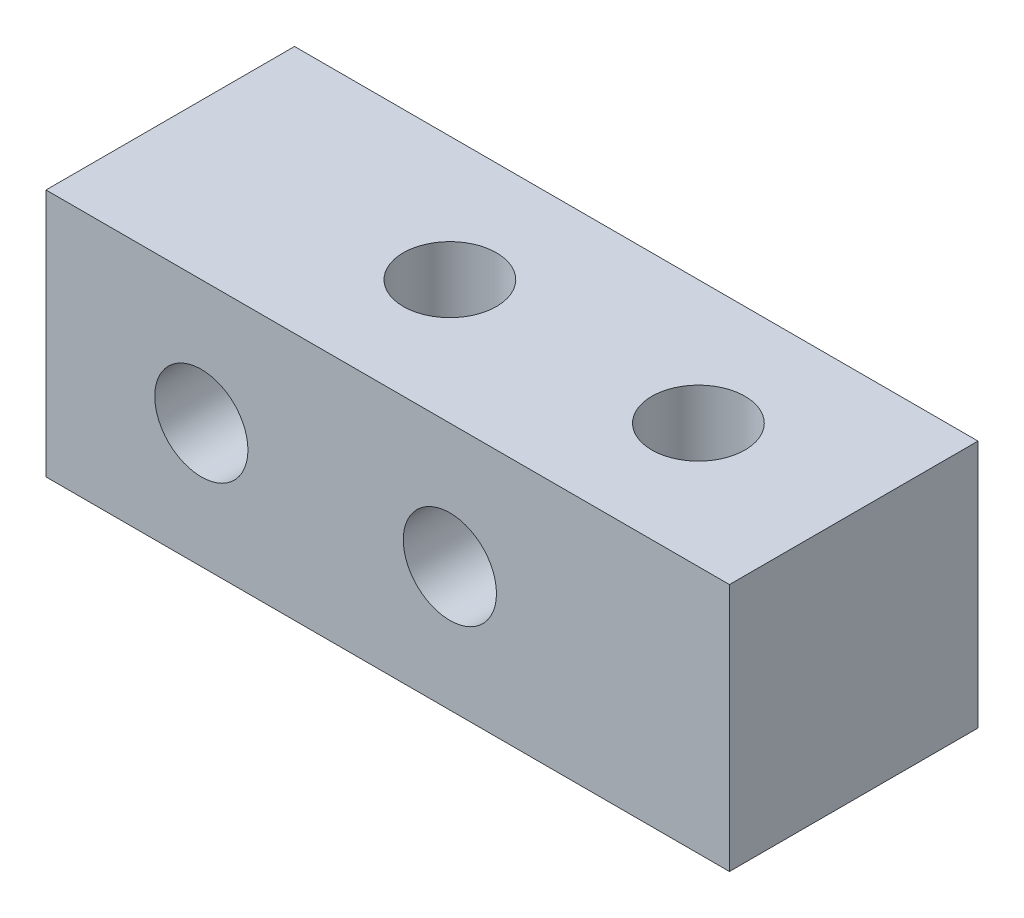
ISO-10303-21;
HEADER;
FILE_DESCRIPTION(('STEP AP214'),'2;1');
FILE_NAME('part.step','',(''),(''),'','','');
FILE_SCHEMA(('AUTOMOTIVE_DESIGN { 1 0 10303 214 1 1 1 1 }'));
ENDSEC;
DATA;
#1=APPLICATION_CONTEXT('core data for automotive mechanical design processes');
#2=APPLICATION_PROTOCOL_DEFINITION('international standard','automotive_design',2000,#1);
#3=PRODUCT_CONTEXT('',#1,'mechanical');
#4=PRODUCT('Part','Part','',(#3));
#5=PRODUCT_RELATED_PRODUCT_CATEGORY('part','',(#4));
#6=PRODUCT_DEFINITION_FORMATION('','',#4);
#7=PRODUCT_DEFINITION_CONTEXT('part definition',#1,'design');
#8=PRODUCT_DEFINITION('design','',#6,#7);
#9=PRODUCT_DEFINITION_SHAPE('','',#8);
#10=(LENGTH_UNIT() NAMED_UNIT(*) SI_UNIT(.MILLI.,.METRE.));
#11=(NAMED_UNIT(*) PLANE_ANGLE_UNIT() SI_UNIT($,.RADIAN.));
#12=(NAMED_UNIT(*) SI_UNIT($,.STERADIAN.) SOLID_ANGLE_UNIT());
#13=UNCERTAINTY_MEASURE_WITH_UNIT(LENGTH_MEASURE(1.E-05),#10,'distance_accuracy_value','');
#14=(GEOMETRIC_REPRESENTATION_CONTEXT(3) GLOBAL_UNCERTAINTY_ASSIGNED_CONTEXT((#13)) GLOBAL_UNIT_ASSIGNED_CONTEXT((#10,
#11,#12)) REPRESENTATION_CONTEXT('',''));
#15=CARTESIAN_POINT('',(0.,0.,0.));
#16=DIRECTION('',(0.,0.,1.));
#17=DIRECTION('',(1.,0.,0.));
#18=AXIS2_PLACEMENT_3D('',#15,#16,#17);
#19=CARTESIAN_POINT('',(0.,8.,0.));
#20=DIRECTION('',(0.,-1.,0.));
#21=DIRECTION('',(0.,0.,-1.));
#22=AXIS2_PLACEMENT_3D('',#19,#20,#21);
#23=PLANE('',#22);
#24=DIRECTION('',(0.,0.,-1.));
#25=VECTOR('',#24,1.);
#26=CARTESIAN_POINT('',(11.,8.,4.));
#27=LINE('',#26,#25);
#28=CARTESIAN_POINT('',(11.,8.,4.));
#29=VERTEX_POINT('',#28);
#30=CARTESIAN_POINT('',(11.,8.,-4.));
#31=VERTEX_POINT('',#30);
#32=EDGE_CURVE('E93',#29,#31,#27,.T.);
#33=ORIENTED_EDGE('',*,*,#32,.T.);
#34=DIRECTION('',(-1.,0.,0.));
#35=VECTOR('',#34,1.);
#36=CARTESIAN_POINT('',(-11.,8.,-4.));
#37=LINE('',#36,#35);
#38=CARTESIAN_POINT('',(-11.,8.,-4.));
#39=VERTEX_POINT('',#38);
#40=EDGE_CURVE('E88',#31,#39,#37,.T.);
#41=ORIENTED_EDGE('',*,*,#40,.T.);
#42=DIRECTION('',(0.,0.,1.));
#43=VECTOR('',#42,1.);
#44=CARTESIAN_POINT('',(-11.,8.,4.));
#45=LINE('',#44,#43);
#46=CARTESIAN_POINT('',(-11.,8.,4.));
#47=VERTEX_POINT('',#46);
#48=EDGE_CURVE('E91',#39,#47,#45,.T.);
#49=ORIENTED_EDGE('',*,*,#48,.T.);
#50=DIRECTION('',(1.,0.,0.));
#51=VECTOR('',#50,1.);
#52=CARTESIAN_POINT('',(-11.,8.,4.));
#53=LINE('',#52,#51);
#54=EDGE_CURVE('E58',#47,#29,#53,.T.);
#55=ORIENTED_EDGE('',*,*,#54,.T.);
#56=EDGE_LOOP('',(#33,#41,#49,#55));
#57=FACE_BOUND('',#56,.T.);
#58=CARTESIAN_POINT('',(6.,8.,0.));
#59=DIRECTION('',(0.,1.,0.));
#60=DIRECTION('',(0.,0.,1.));
#61=AXIS2_PLACEMENT_3D('',#58,#59,#60);
#62=CIRCLE('',#61,1.5);
#63=CARTESIAN_POINT('',(6.,8.,1.5));
#64=VERTEX_POINT('',#63);
#65=EDGE_CURVE('E108',#64,#64,#62,.T.);
#66=ORIENTED_EDGE('',*,*,#65,.F.);
#67=EDGE_LOOP('',(#66));
#68=FACE_BOUND('',#67,.T.);
#69=CARTESIAN_POINT('',(-2.,8.,0.));
#70=DIRECTION('',(0.,1.,0.));
#71=DIRECTION('',(0.,0.,1.));
#72=AXIS2_PLACEMENT_3D('',#69,#70,#71);
#73=CIRCLE('',#72,1.5);
#74=CARTESIAN_POINT('',(-2.,8.,1.5));
#75=VERTEX_POINT('',#74);
#76=EDGE_CURVE('E123',#75,#75,#73,.T.);
#77=ORIENTED_EDGE('',*,*,#76,.F.);
#78=EDGE_LOOP('',(#77));
#79=FACE_BOUND('',#78,.T.);
#80=ADVANCED_FACE('F41',(#57,#68,#79),#23,.F.);
#81=CARTESIAN_POINT('',(0.,0.,0.));
#82=DIRECTION('',(0.,-1.,0.));
#83=DIRECTION('',(0.,0.,-1.));
#84=AXIS2_PLACEMENT_3D('',#81,#82,#83);
#85=PLANE('',#84);
#86=CARTESIAN_POINT('',(6.,0.,0.));
#87=DIRECTION('',(0.,1.,0.));
#88=DIRECTION('',(0.,0.,1.));
#89=AXIS2_PLACEMENT_3D('',#86,#87,#88);
#90=CIRCLE('',#89,1.5);
#91=CARTESIAN_POINT('',(6.,0.,1.5));
#92=VERTEX_POINT('',#91);
#93=EDGE_CURVE('E120',#92,#92,#90,.T.);
#94=ORIENTED_EDGE('',*,*,#93,.T.);
#95=EDGE_LOOP('',(#94));
#96=FACE_BOUND('',#95,.T.);
#97=DIRECTION('',(0.,0.,-1.));
#98=VECTOR('',#97,1.);
#99=CARTESIAN_POINT('',(11.,0.,4.));
#100=LINE('',#99,#98);
#101=CARTESIAN_POINT('',(11.,0.,4.));
#102=VERTEX_POINT('',#101);
#103=CARTESIAN_POINT('',(11.,0.,-4.));
#104=VERTEX_POINT('',#103);
#105=EDGE_CURVE('E105',#102,#104,#100,.T.);
#106=ORIENTED_EDGE('',*,*,#105,.F.);
#107=DIRECTION('',(1.,0.,0.));
#108=VECTOR('',#107,1.);
#109=CARTESIAN_POINT('',(-11.,0.,4.));
#110=LINE('',#109,#108);
#111=CARTESIAN_POINT('',(-11.,0.,4.));
#112=VERTEX_POINT('',#111);
#113=EDGE_CURVE('E81',#112,#102,#110,.T.);
#114=ORIENTED_EDGE('',*,*,#113,.F.);
#115=DIRECTION('',(0.,0.,1.));
#116=VECTOR('',#115,1.);
#117=CARTESIAN_POINT('',(-11.,0.,4.));
#118=LINE('',#117,#116);
#119=CARTESIAN_POINT('',(-11.,0.,-4.));
#120=VERTEX_POINT('',#119);
#121=EDGE_CURVE('E75',#120,#112,#118,.T.);
#122=ORIENTED_EDGE('',*,*,#121,.F.);
#123=DIRECTION('',(-1.,0.,0.));
#124=VECTOR('',#123,1.);
#125=CARTESIAN_POINT('',(-11.,0.,-4.));
#126=LINE('',#125,#124);
#127=EDGE_CURVE('E97',#104,#120,#126,.T.);
#128=ORIENTED_EDGE('',*,*,#127,.F.);
#129=EDGE_LOOP('',(#106,#114,#122,#128));
#130=FACE_BOUND('',#129,.T.);
#131=CARTESIAN_POINT('',(-2.,0.,0.));
#132=DIRECTION('',(0.,1.,0.));
#133=DIRECTION('',(0.,0.,1.));
#134=AXIS2_PLACEMENT_3D('',#131,#132,#133);
#135=CIRCLE('',#134,1.5);
#136=CARTESIAN_POINT('',(-2.,0.,1.5));
#137=VERTEX_POINT('',#136);
#138=EDGE_CURVE('E126',#137,#137,#135,.T.);
#139=ORIENTED_EDGE('',*,*,#138,.T.);
#140=EDGE_LOOP('',(#139));
#141=FACE_BOUND('',#140,.T.);
#142=ADVANCED_FACE('F116',(#96,#130,#141),#85,.T.);
#143=CARTESIAN_POINT('',(11.,8.,4.));
#144=DIRECTION('',(-1.,0.,0.));
#145=DIRECTION('',(0.,0.,1.));
#146=AXIS2_PLACEMENT_3D('',#143,#144,#145);
#147=PLANE('',#146);
#148=ORIENTED_EDGE('',*,*,#105,.T.);
#149=DIRECTION('',(0.,-1.,0.));
#150=VECTOR('',#149,1.);
#151=CARTESIAN_POINT('',(11.,8.,-4.));
#152=LINE('',#151,#150);
#153=EDGE_CURVE('E11',#31,#104,#152,.T.);
#154=ORIENTED_EDGE('',*,*,#153,.F.);
#155=ORIENTED_EDGE('',*,*,#32,.F.);
#156=DIRECTION('',(0.,-1.,0.));
#157=VECTOR('',#156,1.);
#158=CARTESIAN_POINT('',(11.,8.,4.));
#159=LINE('',#158,#157);
#160=EDGE_CURVE('E101',#29,#102,#159,.T.);
#161=ORIENTED_EDGE('',*,*,#160,.T.);
#162=EDGE_LOOP('',(#148,#154,#155,#161));
#163=FACE_BOUND('',#162,.T.);
#164=ADVANCED_FACE('F43',(#163),#147,.F.);
#165=CARTESIAN_POINT('',(-11.,8.,-4.));
#166=DIRECTION('',(0.,0.,1.));
#167=DIRECTION('',(1.,0.,0.));
#168=AXIS2_PLACEMENT_3D('',#165,#166,#167);
#169=PLANE('',#168);
#170=CARTESIAN_POINT('',(-6.,4.,-4.));
#171=DIRECTION('',(0.,0.,1.));
#172=DIRECTION('',(1.,0.,0.));
#173=AXIS2_PLACEMENT_3D('',#170,#171,#172);
#174=CIRCLE('',#173,1.5);
#175=CARTESIAN_POINT('',(-4.5,4.,-4.));
#176=VERTEX_POINT('',#175);
#177=EDGE_CURVE('E129',#176,#176,#174,.T.);
#178=ORIENTED_EDGE('',*,*,#177,.T.);
#179=EDGE_LOOP('',(#178));
#180=FACE_BOUND('',#179,.T.);
#181=CARTESIAN_POINT('',(2.,4.,-4.));
#182=DIRECTION('',(0.,0.,1.));
#183=DIRECTION('',(1.,0.,0.));
#184=AXIS2_PLACEMENT_3D('',#181,#182,#183);
#185=CIRCLE('',#184,1.5);
#186=CARTESIAN_POINT('',(3.5,4.,-4.));
#187=VERTEX_POINT('',#186);
#188=EDGE_CURVE('E132',#187,#187,#185,.T.);
#189=ORIENTED_EDGE('',*,*,#188,.T.);
#190=EDGE_LOOP('',(#189));
#191=FACE_BOUND('',#190,.T.);
#192=ORIENTED_EDGE('',*,*,#127,.T.);
#193=DIRECTION('',(0.,-1.,0.));
#194=VECTOR('',#193,1.);
#195=CARTESIAN_POINT('',(-11.,8.,-4.));
#196=LINE('',#195,#194);
#197=EDGE_CURVE('E50',#39,#120,#196,.T.);
#198=ORIENTED_EDGE('',*,*,#197,.F.);
#199=ORIENTED_EDGE('',*,*,#40,.F.);
#200=ORIENTED_EDGE('',*,*,#153,.T.);
#201=EDGE_LOOP('',(#192,#198,#199,#200));
#202=FACE_BOUND('',#201,.T.);
#203=ADVANCED_FACE('F96',(#180,#191,#202),#169,.F.);
#204=CARTESIAN_POINT('',(-11.,8.,4.));
#205=DIRECTION('',(1.,0.,0.));
#206=DIRECTION('',(0.,0.,-1.));
#207=AXIS2_PLACEMENT_3D('',#204,#205,#206);
#208=PLANE('',#207);
#209=ORIENTED_EDGE('',*,*,#121,.T.);
#210=DIRECTION('',(0.,-1.,0.));
#211=VECTOR('',#210,1.);
#212=CARTESIAN_POINT('',(-11.,8.,4.));
#213=LINE('',#212,#211);
#214=EDGE_CURVE('E98',#47,#112,#213,.T.);
#215=ORIENTED_EDGE('',*,*,#214,.F.);
#216=ORIENTED_EDGE('',*,*,#48,.F.);
#217=ORIENTED_EDGE('',*,*,#197,.T.);
#218=EDGE_LOOP('',(#209,#215,#216,#217));
#219=FACE_BOUND('',#218,.T.);
#220=ADVANCED_FACE('F99',(#219),#208,.F.);
#221=CARTESIAN_POINT('',(-11.,8.,4.));
#222=DIRECTION('',(0.,0.,-1.));
#223=DIRECTION('',(-1.,0.,0.));
#224=AXIS2_PLACEMENT_3D('',#221,#222,#223);
#225=PLANE('',#224);
#226=CARTESIAN_POINT('',(-6.,4.,4.));
#227=DIRECTION('',(0.,0.,1.));
#228=DIRECTION('',(1.,0.,0.));
#229=AXIS2_PLACEMENT_3D('',#226,#227,#228);
#230=CIRCLE('',#229,1.5);
#231=CARTESIAN_POINT('',(-4.5,4.,4.));
#232=VERTEX_POINT('',#231);
#233=EDGE_CURVE('E138',#232,#232,#230,.T.);
#234=ORIENTED_EDGE('',*,*,#233,.F.);
#235=EDGE_LOOP('',(#234));
#236=FACE_BOUND('',#235,.T.);
#237=CARTESIAN_POINT('',(2.,4.,4.));
#238=DIRECTION('',(0.,0.,1.));
#239=DIRECTION('',(1.,0.,0.));
#240=AXIS2_PLACEMENT_3D('',#237,#238,#239);
#241=CIRCLE('',#240,1.5);
#242=CARTESIAN_POINT('',(3.5,4.,4.));
#243=VERTEX_POINT('',#242);
#244=EDGE_CURVE('E135',#243,#243,#241,.T.);
#245=ORIENTED_EDGE('',*,*,#244,.F.);
#246=EDGE_LOOP('',(#245));
#247=FACE_BOUND('',#246,.T.);
#248=ORIENTED_EDGE('',*,*,#113,.T.);
#249=ORIENTED_EDGE('',*,*,#160,.F.);
#250=ORIENTED_EDGE('',*,*,#54,.F.);
#251=ORIENTED_EDGE('',*,*,#214,.T.);
#252=EDGE_LOOP('',(#248,#249,#250,#251));
#253=FACE_BOUND('',#252,.T.);
#254=ADVANCED_FACE('F113',(#236,#247,#253),#225,.F.);
#255=CARTESIAN_POINT('',(6.,8.,0.));
#256=DIRECTION('',(0.,-1.,0.));
#257=DIRECTION('',(0.,0.,-1.));
#258=AXIS2_PLACEMENT_3D('',#255,#256,#257);
#259=CYLINDRICAL_SURFACE('',#258,1.5);
#260=ORIENTED_EDGE('',*,*,#65,.T.);
#261=EDGE_LOOP('',(#260));
#262=FACE_BOUND('',#261,.T.);
#263=ORIENTED_EDGE('',*,*,#93,.F.);
#264=EDGE_LOOP('',(#263));
#265=FACE_BOUND('',#264,.T.);
#266=ADVANCED_FACE('F155',(#262,#265),#259,.F.);
#267=CARTESIAN_POINT('',(-2.,8.,0.));
#268=DIRECTION('',(0.,-1.,0.));
#269=DIRECTION('',(0.,0.,-1.));
#270=AXIS2_PLACEMENT_3D('',#267,#268,#269);
#271=CYLINDRICAL_SURFACE('',#270,1.5);
#272=ORIENTED_EDGE('',*,*,#76,.T.);
#273=EDGE_LOOP('',(#272));
#274=FACE_BOUND('',#273,.T.);
#275=ORIENTED_EDGE('',*,*,#138,.F.);
#276=EDGE_LOOP('',(#275));
#277=FACE_BOUND('',#276,.T.);
#278=ADVANCED_FACE('F160',(#274,#277),#271,.F.);
#279=CARTESIAN_POINT('',(2.,4.,-4.));
#280=DIRECTION('',(0.,0.,1.));
#281=DIRECTION('',(1.,0.,0.));
#282=AXIS2_PLACEMENT_3D('',#279,#280,#281);
#283=CYLINDRICAL_SURFACE('',#282,1.5);
#284=ORIENTED_EDGE('',*,*,#188,.F.);
#285=EDGE_LOOP('',(#284));
#286=FACE_BOUND('',#285,.T.);
#287=ORIENTED_EDGE('',*,*,#244,.T.);
#288=EDGE_LOOP('',(#287));
#289=FACE_BOUND('',#288,.T.);
#290=ADVANCED_FACE('F149',(#286,#289),#283,.F.);
#291=CARTESIAN_POINT('',(-6.,4.,-4.));
#292=DIRECTION('',(0.,0.,1.));
#293=DIRECTION('',(1.,0.,0.));
#294=AXIS2_PLACEMENT_3D('',#291,#292,#293);
#295=CYLINDRICAL_SURFACE('',#294,1.5);
#296=ORIENTED_EDGE('',*,*,#177,.F.);
#297=EDGE_LOOP('',(#296));
#298=FACE_BOUND('',#297,.T.);
#299=ORIENTED_EDGE('',*,*,#233,.T.);
#300=EDGE_LOOP('',(#299));
#301=FACE_BOUND('',#300,.T.);
#302=ADVANCED_FACE('F146',(#298,#301),#295,.F.);
#303=CLOSED_SHELL('',(#80,#142,#164,#203,#220,#254,#266,#278,#290,#302));
#304=MANIFOLD_SOLID_BREP('B2',#303);
#305=ADVANCED_BREP_SHAPE_REPRESENTATION('',(#18,#304),#14);
#306=SHAPE_DEFINITION_REPRESENTATION(#9,#305);
ENDSEC;
END-ISO-10303-21;
